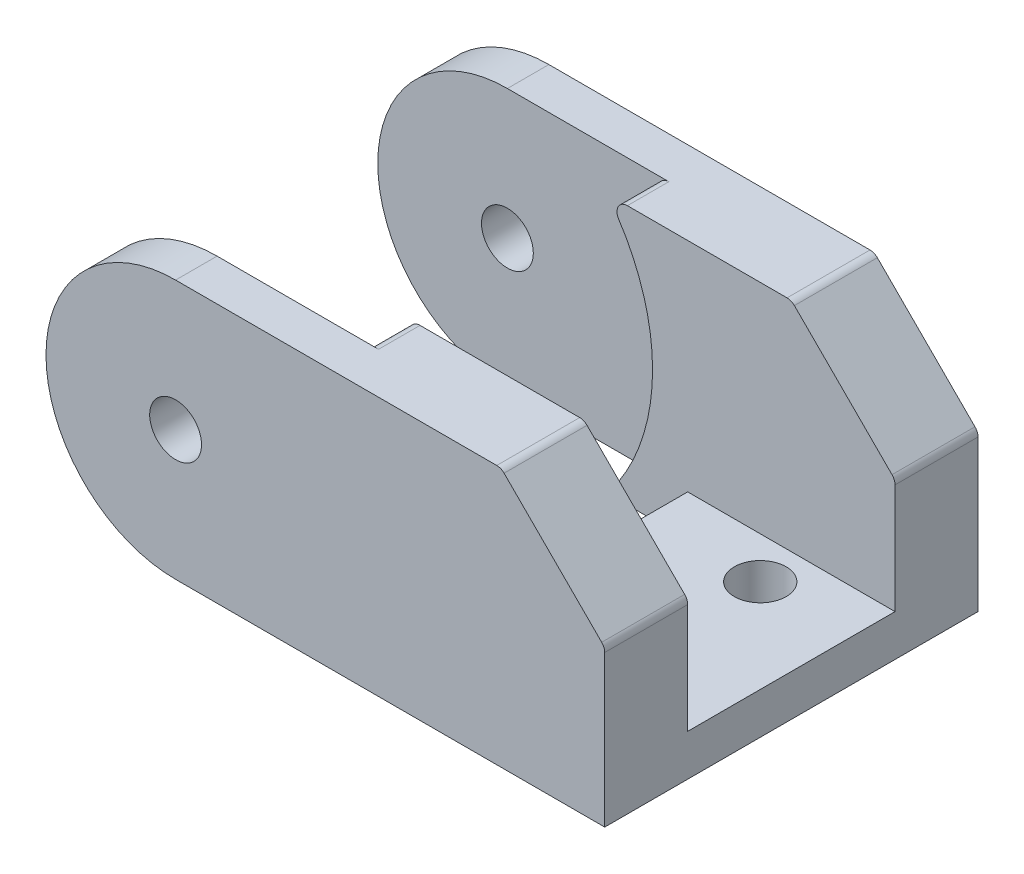
ISO-10303-21;
HEADER;
FILE_DESCRIPTION(('STEP AP214'),'2;1');
FILE_NAME('part.step','',(''),(''),'','','');
FILE_SCHEMA(('AUTOMOTIVE_DESIGN { 1 0 10303 214 1 1 1 1 }'));
ENDSEC;
DATA;
#1=APPLICATION_CONTEXT('core data for automotive mechanical design processes');
#2=APPLICATION_PROTOCOL_DEFINITION('international standard','automotive_design',2000,#1);
#3=PRODUCT_CONTEXT('',#1,'mechanical');
#4=PRODUCT('Part','Part','',(#3));
#5=PRODUCT_RELATED_PRODUCT_CATEGORY('part','',(#4));
#6=PRODUCT_DEFINITION_FORMATION('','',#4);
#7=PRODUCT_DEFINITION_CONTEXT('part definition',#1,'design');
#8=PRODUCT_DEFINITION('design','',#6,#7);
#9=PRODUCT_DEFINITION_SHAPE('','',#8);
#10=(LENGTH_UNIT() NAMED_UNIT(*) SI_UNIT(.MILLI.,.METRE.));
#11=(NAMED_UNIT(*) PLANE_ANGLE_UNIT() SI_UNIT($,.RADIAN.));
#12=(NAMED_UNIT(*) SI_UNIT($,.STERADIAN.) SOLID_ANGLE_UNIT());
#13=UNCERTAINTY_MEASURE_WITH_UNIT(LENGTH_MEASURE(1.E-05),#10,'distance_accuracy_value','');
#14=(GEOMETRIC_REPRESENTATION_CONTEXT(3) GLOBAL_UNCERTAINTY_ASSIGNED_CONTEXT((#13)) GLOBAL_UNIT_ASSIGNED_CONTEXT((#10,
#11,#12)) REPRESENTATION_CONTEXT('',''));
#15=CARTESIAN_POINT('',(0.,0.,0.));
#16=DIRECTION('',(0.,0.,1.));
#17=DIRECTION('',(1.,0.,0.));
#18=AXIS2_PLACEMENT_3D('',#15,#16,#17);
#19=CARTESIAN_POINT('',(0.,0.,2.));
#20=DIRECTION('',(0.,0.,1.));
#21=DIRECTION('',(1.,0.,0.));
#22=AXIS2_PLACEMENT_3D('',#19,#20,#21);
#23=PLANE('',#22);
#24=CARTESIAN_POINT('',(0.,0.,2.));
#25=DIRECTION('',(0.,0.,1.));
#26=DIRECTION('',(1.,0.,0.));
#27=AXIS2_PLACEMENT_3D('',#24,#25,#26);
#28=CIRCLE('',#27,1.25);
#29=CARTESIAN_POINT('',(1.25,0.,2.));
#30=VERTEX_POINT('',#29);
#31=EDGE_CURVE('E325',#30,#30,#28,.T.);
#32=ORIENTED_EDGE('',*,*,#31,.F.);
#33=EDGE_LOOP('',(#32));
#34=FACE_BOUND('',#33,.T.);
#35=CARTESIAN_POINT('',(-1.,0.,2.));
#36=DIRECTION('',(0.,0.,1.));
#37=DIRECTION('',(1.,0.,0.));
#38=AXIS2_PLACEMENT_3D('',#35,#36,#37);
#39=CIRCLE('',#38,10.);
#40=CARTESIAN_POINT('',(7.36727780514551,5.47619047619047,2.));
#41=VERTEX_POINT('',#40);
#42=CARTESIAN_POINT('',(7.36727780514551,-5.47619047619047,2.));
#43=VERTEX_POINT('',#42);
#44=EDGE_CURVE('E382',#41,#43,#39,.F.);
#45=ORIENTED_EDGE('',*,*,#44,.F.);
#46=CARTESIAN_POINT('',(7.78564169540279,5.75,2.));
#47=DIRECTION('',(0.,0.,1.));
#48=DIRECTION('',(1.,0.,0.));
#49=AXIS2_PLACEMENT_3D('',#46,#47,#48);
#50=CIRCLE('',#49,0.5);
#51=CARTESIAN_POINT('',(7.78564169540279,6.25,2.));
#52=VERTEX_POINT('',#51);
#53=EDGE_CURVE('E318',#41,#52,#50,.F.);
#54=ORIENTED_EDGE('',*,*,#53,.T.);
#55=DIRECTION('',(1.,0.,0.));
#56=VECTOR('',#55,1.);
#57=CARTESIAN_POINT('',(0.,6.25,2.));
#58=LINE('',#57,#56);
#59=CARTESIAN_POINT('',(0.,6.25,2.));
#60=VERTEX_POINT('',#59);
#61=EDGE_CURVE('E260',#60,#52,#58,.T.);
#62=ORIENTED_EDGE('',*,*,#61,.F.);
#63=CARTESIAN_POINT('',(0.,0.,2.));
#64=DIRECTION('',(0.,0.,1.));
#65=DIRECTION('',(1.,0.,0.));
#66=AXIS2_PLACEMENT_3D('',#63,#64,#65);
#67=CIRCLE('',#66,6.25);
#68=CARTESIAN_POINT('',(0.,-6.25,2.));
#69=VERTEX_POINT('',#68);
#70=EDGE_CURVE('E262',#60,#69,#67,.T.);
#71=ORIENTED_EDGE('',*,*,#70,.T.);
#72=DIRECTION('',(-1.,0.,0.));
#73=VECTOR('',#72,1.);
#74=CARTESIAN_POINT('',(0.,-6.25,2.));
#75=LINE('',#74,#73);
#76=CARTESIAN_POINT('',(7.78564169540279,-6.25,2.));
#77=VERTEX_POINT('',#76);
#78=EDGE_CURVE('E266',#77,#69,#75,.T.);
#79=ORIENTED_EDGE('',*,*,#78,.F.);
#80=CARTESIAN_POINT('',(7.78564169540279,-5.75,2.));
#81=DIRECTION('',(0.,0.,1.));
#82=DIRECTION('',(1.,0.,0.));
#83=AXIS2_PLACEMENT_3D('',#80,#81,#82);
#84=CIRCLE('',#83,0.5);
#85=EDGE_CURVE('E316',#77,#43,#84,.F.);
#86=ORIENTED_EDGE('',*,*,#85,.T.);
#87=EDGE_LOOP('',(#45,#54,#62,#71,#79,#86));
#88=FACE_BOUND('',#87,.T.);
#89=ADVANCED_FACE('F48',(#34,#88),#23,.T.);
#90=CARTESIAN_POINT('',(0.,-4.25,0.));
#91=DIRECTION('',(0.,1.,0.));
#92=DIRECTION('',(-1.,0.,0.));
#93=AXIS2_PLACEMENT_3D('',#90,#91,#92);
#94=PLANE('',#93);
#95=CARTESIAN_POINT('',(16.193752502002,-4.25,12.));
#96=DIRECTION('',(0.,1.,0.));
#97=DIRECTION('',(1.,0.,0.));
#98=AXIS2_PLACEMENT_3D('',#95,#96,#97);
#99=CIRCLE('',#98,1.25);
#100=CARTESIAN_POINT('',(17.443752502002,-4.25,12.));
#101=VERTEX_POINT('',#100);
#102=EDGE_CURVE('E480',#101,#101,#99,.T.);
#103=ORIENTED_EDGE('',*,*,#102,.F.);
#104=EDGE_LOOP('',(#103));
#105=FACE_BOUND('',#104,.T.);
#106=CARTESIAN_POINT('',(16.193752502002,-4.25,6.));
#107=DIRECTION('',(0.,1.,0.));
#108=DIRECTION('',(-1.,0.,0.));
#109=AXIS2_PLACEMENT_3D('',#106,#107,#108);
#110=CIRCLE('',#109,1.25);
#111=CARTESIAN_POINT('',(14.943752502002,-4.25,6.));
#112=VERTEX_POINT('',#111);
#113=EDGE_CURVE('E474',#112,#112,#110,.T.);
#114=ORIENTED_EDGE('',*,*,#113,.F.);
#115=EDGE_LOOP('',(#114));
#116=FACE_BOUND('',#115,.T.);
#117=DIRECTION('',(-1.,0.,0.));
#118=VECTOR('',#117,1.);
#119=CARTESIAN_POINT('',(0.,-4.25,14.));
#120=LINE('',#119,#118);
#121=CARTESIAN_POINT('',(20.693752502002,-4.25,14.));
#122=VERTEX_POINT('',#121);
#123=CARTESIAN_POINT('',(10.693752502002,-4.25,14.));
#124=VERTEX_POINT('',#123);
#125=EDGE_CURVE('E237',#122,#124,#120,.T.);
#126=ORIENTED_EDGE('',*,*,#125,.F.);
#127=DIRECTION('',(0.,0.,1.));
#128=VECTOR('',#127,1.);
#129=CARTESIAN_POINT('',(20.693752502002,-4.25,18.));
#130=LINE('',#129,#128);
#131=CARTESIAN_POINT('',(20.693752502002,-4.25,4.));
#132=VERTEX_POINT('',#131);
#133=EDGE_CURVE('E231',#132,#122,#130,.T.);
#134=ORIENTED_EDGE('',*,*,#133,.F.);
#135=DIRECTION('',(1.,0.,0.));
#136=VECTOR('',#135,1.);
#137=CARTESIAN_POINT('',(0.,-4.25,4.));
#138=LINE('',#137,#136);
#139=CARTESIAN_POINT('',(10.693752502002,-4.25,4.));
#140=VERTEX_POINT('',#139);
#141=EDGE_CURVE('E213',#140,#132,#138,.T.);
#142=ORIENTED_EDGE('',*,*,#141,.F.);
#143=DIRECTION('',(0.,0.,-1.));
#144=VECTOR('',#143,1.);
#145=CARTESIAN_POINT('',(10.693752502002,-4.25,18.));
#146=LINE('',#145,#144);
#147=EDGE_CURVE('E241',#124,#140,#146,.T.);
#148=ORIENTED_EDGE('',*,*,#147,.F.);
#149=EDGE_LOOP('',(#126,#134,#142,#148));
#150=FACE_BOUND('',#149,.T.);
#151=ADVANCED_FACE('F239',(#105,#116,#150),#94,.T.);
#152=CARTESIAN_POINT('',(0.,6.25,2.));
#153=DIRECTION('',(0.,1.,0.));
#154=DIRECTION('',(-1.,0.,0.));
#155=AXIS2_PLACEMENT_3D('',#152,#153,#154);
#156=PLANE('',#155);
#157=DIRECTION('',(1.,0.,0.));
#158=VECTOR('',#157,1.);
#159=CARTESIAN_POINT('',(0.,6.25,4.));
#160=LINE('',#159,#158);
#161=CARTESIAN_POINT('',(7.78564169540279,6.25,4.));
#162=VERTEX_POINT('',#161);
#163=CARTESIAN_POINT('',(15.4866457208155,6.25,4.));
#164=VERTEX_POINT('',#163);
#165=EDGE_CURVE('E367',#162,#164,#160,.T.);
#166=ORIENTED_EDGE('',*,*,#165,.T.);
#167=DIRECTION('',(0.,0.,1.));
#168=VECTOR('',#167,1.);
#169=CARTESIAN_POINT('',(15.4866457208155,6.25,2.));
#170=LINE('',#169,#168);
#171=CARTESIAN_POINT('',(15.4866457208155,6.25,0.));
#172=VERTEX_POINT('',#171);
#173=EDGE_CURVE('E56',#164,#172,#170,.F.);
#174=ORIENTED_EDGE('',*,*,#173,.T.);
#175=DIRECTION('',(1.,0.,0.));
#176=VECTOR('',#175,1.);
#177=CARTESIAN_POINT('',(0.,6.25,0.));
#178=LINE('',#177,#176);
#179=CARTESIAN_POINT('',(0.,6.25,0.));
#180=VERTEX_POINT('',#179);
#181=EDGE_CURVE('E259',#180,#172,#178,.T.);
#182=ORIENTED_EDGE('',*,*,#181,.F.);
#183=DIRECTION('',(0.,0.,-1.));
#184=VECTOR('',#183,1.);
#185=CARTESIAN_POINT('',(0.,6.25,2.));
#186=LINE('',#185,#184);
#187=EDGE_CURVE('E224',#60,#180,#186,.T.);
#188=ORIENTED_EDGE('',*,*,#187,.F.);
#189=ORIENTED_EDGE('',*,*,#61,.T.);
#190=DIRECTION('',(0.,0.,-1.));
#191=VECTOR('',#190,1.);
#192=CARTESIAN_POINT('',(7.78564169540279,6.25,2.));
#193=LINE('',#192,#191);
#194=EDGE_CURVE('E309',#52,#162,#193,.F.);
#195=ORIENTED_EDGE('',*,*,#194,.T.);
#196=EDGE_LOOP('',(#166,#174,#182,#188,#189,#195));
#197=FACE_BOUND('',#196,.T.);
#198=ADVANCED_FACE('F365',(#197),#156,.T.);
#199=CARTESIAN_POINT('',(0.,0.,2.));
#200=DIRECTION('',(0.,0.,-1.));
#201=DIRECTION('',(-1.,0.,0.));
#202=AXIS2_PLACEMENT_3D('',#199,#200,#201);
#203=CYLINDRICAL_SURFACE('',#202,6.25);
#204=CARTESIAN_POINT('',(0.,0.,0.));
#205=DIRECTION('',(0.,0.,1.));
#206=DIRECTION('',(1.,0.,0.));
#207=AXIS2_PLACEMENT_3D('',#204,#205,#206);
#208=CIRCLE('',#207,6.25);
#209=CARTESIAN_POINT('',(0.,-6.25,0.));
#210=VERTEX_POINT('',#209);
#211=EDGE_CURVE('E271',#180,#210,#208,.T.);
#212=ORIENTED_EDGE('',*,*,#211,.T.);
#213=DIRECTION('',(0.,0.,-1.));
#214=VECTOR('',#213,1.);
#215=CARTESIAN_POINT('',(0.,-6.25,2.));
#216=LINE('',#215,#214);
#217=EDGE_CURVE('E268',#69,#210,#216,.T.);
#218=ORIENTED_EDGE('',*,*,#217,.F.);
#219=ORIENTED_EDGE('',*,*,#70,.F.);
#220=ORIENTED_EDGE('',*,*,#187,.T.);
#221=EDGE_LOOP('',(#212,#218,#219,#220));
#222=FACE_BOUND('',#221,.T.);
#223=ADVANCED_FACE('F375',(#222),#203,.T.);
#224=CARTESIAN_POINT('',(0.,-6.25,2.));
#225=DIRECTION('',(0.,-1.,0.));
#226=DIRECTION('',(1.,0.,0.));
#227=AXIS2_PLACEMENT_3D('',#224,#225,#226);
#228=PLANE('',#227);
#229=CARTESIAN_POINT('',(16.193752502002,-6.25,12.));
#230=DIRECTION('',(0.,1.,0.));
#231=DIRECTION('',(1.,0.,0.));
#232=AXIS2_PLACEMENT_3D('',#229,#230,#231);
#233=CIRCLE('',#232,1.25);
#234=CARTESIAN_POINT('',(17.443752502002,-6.25,12.));
#235=VERTEX_POINT('',#234);
#236=EDGE_CURVE('E477',#235,#235,#233,.T.);
#237=ORIENTED_EDGE('',*,*,#236,.T.);
#238=EDGE_LOOP('',(#237));
#239=FACE_BOUND('',#238,.T.);
#240=CARTESIAN_POINT('',(16.193752502002,-6.25,6.));
#241=DIRECTION('',(0.,1.,0.));
#242=DIRECTION('',(-1.,0.,0.));
#243=AXIS2_PLACEMENT_3D('',#240,#241,#242);
#244=CIRCLE('',#243,1.25);
#245=CARTESIAN_POINT('',(14.943752502002,-6.25,6.));
#246=VERTEX_POINT('',#245);
#247=EDGE_CURVE('E471',#246,#246,#244,.T.);
#248=ORIENTED_EDGE('',*,*,#247,.T.);
#249=EDGE_LOOP('',(#248));
#250=FACE_BOUND('',#249,.T.);
#251=DIRECTION('',(-1.,0.,0.));
#252=VECTOR('',#251,1.);
#253=CARTESIAN_POINT('',(0.,-6.25,16.));
#254=LINE('',#253,#252);
#255=CARTESIAN_POINT('',(7.78564169540279,-6.25,16.));
#256=VERTEX_POINT('',#255);
#257=CARTESIAN_POINT('',(0.,-6.25,16.));
#258=VERTEX_POINT('',#257);
#259=EDGE_CURVE('E407',#256,#258,#254,.T.);
#260=ORIENTED_EDGE('',*,*,#259,.F.);
#261=DIRECTION('',(0.,0.,-1.));
#262=VECTOR('',#261,1.);
#263=CARTESIAN_POINT('',(7.78564169540279,-6.25,14.));
#264=LINE('',#263,#262);
#265=CARTESIAN_POINT('',(7.78564169540279,-6.25,14.));
#266=VERTEX_POINT('',#265);
#267=EDGE_CURVE('E291',#256,#266,#264,.T.);
#268=ORIENTED_EDGE('',*,*,#267,.T.);
#269=DIRECTION('',(-1.,0.,0.));
#270=VECTOR('',#269,1.);
#271=CARTESIAN_POINT('',(0.,-6.25,14.));
#272=LINE('',#271,#270);
#273=CARTESIAN_POINT('',(10.693752502002,-6.25,14.));
#274=VERTEX_POINT('',#273);
#275=EDGE_CURVE('E443',#274,#266,#272,.T.);
#276=ORIENTED_EDGE('',*,*,#275,.F.);
#277=DIRECTION('',(0.,0.,-1.));
#278=VECTOR('',#277,1.);
#279=CARTESIAN_POINT('',(10.693752502002,-6.25,18.));
#280=LINE('',#279,#278);
#281=CARTESIAN_POINT('',(10.693752502002,-6.25,4.));
#282=VERTEX_POINT('',#281);
#283=EDGE_CURVE('E242',#274,#282,#280,.T.);
#284=ORIENTED_EDGE('',*,*,#283,.T.);
#285=DIRECTION('',(-1.,0.,0.));
#286=VECTOR('',#285,1.);
#287=CARTESIAN_POINT('',(0.,-6.25,4.));
#288=LINE('',#287,#286);
#289=CARTESIAN_POINT('',(7.78564169540279,-6.25,4.));
#290=VERTEX_POINT('',#289);
#291=EDGE_CURVE('E236',#282,#290,#288,.T.);
#292=ORIENTED_EDGE('',*,*,#291,.T.);
#293=DIRECTION('',(0.,0.,-1.));
#294=VECTOR('',#293,1.);
#295=CARTESIAN_POINT('',(7.78564169540279,-6.25,2.));
#296=LINE('',#295,#294);
#297=EDGE_CURVE('E288',#290,#77,#296,.T.);
#298=ORIENTED_EDGE('',*,*,#297,.T.);
#299=ORIENTED_EDGE('',*,*,#78,.T.);
#300=ORIENTED_EDGE('',*,*,#217,.T.);
#301=DIRECTION('',(-1.,0.,0.));
#302=VECTOR('',#301,1.);
#303=CARTESIAN_POINT('',(0.,-6.25,0.));
#304=LINE('',#303,#302);
#305=CARTESIAN_POINT('',(20.693752502002,-6.25,0.));
#306=VERTEX_POINT('',#305);
#307=EDGE_CURVE('E263',#306,#210,#304,.T.);
#308=ORIENTED_EDGE('',*,*,#307,.F.);
#309=DIRECTION('',(0.,0.,-1.));
#310=VECTOR('',#309,1.);
#311=CARTESIAN_POINT('',(20.693752502002,-6.25,2.));
#312=LINE('',#311,#310);
#313=CARTESIAN_POINT('',(20.693752502002,-6.25,18.));
#314=VERTEX_POINT('',#313);
#315=EDGE_CURVE('E256',#314,#306,#312,.T.);
#316=ORIENTED_EDGE('',*,*,#315,.F.);
#317=DIRECTION('',(-1.,0.,0.));
#318=VECTOR('',#317,1.);
#319=CARTESIAN_POINT('',(20.693752502002,-6.25,18.));
#320=LINE('',#319,#318);
#321=CARTESIAN_POINT('',(0.,-6.25,18.));
#322=VERTEX_POINT('',#321);
#323=EDGE_CURVE('E246',#314,#322,#320,.T.);
#324=ORIENTED_EDGE('',*,*,#323,.T.);
#325=DIRECTION('',(0.,0.,1.));
#326=VECTOR('',#325,1.);
#327=CARTESIAN_POINT('',(0.,-6.25,16.));
#328=LINE('',#327,#326);
#329=EDGE_CURVE('E409',#258,#322,#328,.T.);
#330=ORIENTED_EDGE('',*,*,#329,.F.);
#331=EDGE_LOOP('',(#260,#268,#276,#284,#292,#298,#299,#300,#308,#316,#324,#330));
#332=FACE_BOUND('',#331,.T.);
#333=ADVANCED_FACE('F449',(#239,#250,#332),#228,.T.);
#334=CARTESIAN_POINT('',(0.,0.,0.));
#335=DIRECTION('',(0.,0.,1.));
#336=DIRECTION('',(1.,0.,0.));
#337=AXIS2_PLACEMENT_3D('',#334,#335,#336);
#338=PLANE('',#337);
#339=CARTESIAN_POINT('',(0.,0.,0.));
#340=DIRECTION('',(0.,0.,1.));
#341=DIRECTION('',(1.,0.,0.));
#342=AXIS2_PLACEMENT_3D('',#339,#340,#341);
#343=CIRCLE('',#342,1.25);
#344=CARTESIAN_POINT('',(1.25,0.,0.));
#345=VERTEX_POINT('',#344);
#346=EDGE_CURVE('E326',#345,#345,#343,.T.);
#347=ORIENTED_EDGE('',*,*,#346,.T.);
#348=EDGE_LOOP('',(#347));
#349=FACE_BOUND('',#348,.T.);
#350=DIRECTION('',(-0.707106781186547,0.707106781186548,0.));
#351=VECTOR('',#350,1.);
#352=CARTESIAN_POINT('',(15.693752502002,6.25,0.));
#353=LINE('',#352,#351);
#354=CARTESIAN_POINT('',(15.8401991114087,6.10355339059327,0.));
#355=VERTEX_POINT('',#354);
#356=CARTESIAN_POINT('',(20.5473058925953,1.39644660940671,0.));
#357=VERTEX_POINT('',#356);
#358=EDGE_CURVE('E332',#355,#357,#353,.F.);
#359=ORIENTED_EDGE('',*,*,#358,.T.);
#360=CARTESIAN_POINT('',(20.193752502002,1.04289321881344,0.));
#361=DIRECTION('',(0.,0.,1.));
#362=DIRECTION('',(1.,0.,0.));
#363=AXIS2_PLACEMENT_3D('',#360,#361,#362);
#364=CIRCLE('',#363,0.5);
#365=CARTESIAN_POINT('',(20.693752502002,1.04289321881344,0.));
#366=VERTEX_POINT('',#365);
#367=EDGE_CURVE('E361',#357,#366,#364,.F.);
#368=ORIENTED_EDGE('',*,*,#367,.T.);
#369=DIRECTION('',(0.,-1.,0.));
#370=VECTOR('',#369,1.);
#371=CARTESIAN_POINT('',(20.693752502002,-6.25,0.));
#372=LINE('',#371,#370);
#373=EDGE_CURVE('E254',#366,#306,#372,.T.);
#374=ORIENTED_EDGE('',*,*,#373,.T.);
#375=ORIENTED_EDGE('',*,*,#307,.T.);
#376=ORIENTED_EDGE('',*,*,#211,.F.);
#377=ORIENTED_EDGE('',*,*,#181,.T.);
#378=CARTESIAN_POINT('',(15.4866457208155,5.75,0.));
#379=DIRECTION('',(0.,0.,1.));
#380=DIRECTION('',(1.,0.,0.));
#381=AXIS2_PLACEMENT_3D('',#378,#379,#380);
#382=CIRCLE('',#381,0.5);
#383=EDGE_CURVE('E63',#172,#355,#382,.F.);
#384=ORIENTED_EDGE('',*,*,#383,.T.);
#385=EDGE_LOOP('',(#359,#368,#374,#375,#376,#377,#384));
#386=FACE_BOUND('',#385,.T.);
#387=ADVANCED_FACE('F371',(#349,#386),#338,.F.);
#388=CARTESIAN_POINT('',(20.693752502002,-6.25,2.));
#389=DIRECTION('',(1.,0.,0.));
#390=DIRECTION('',(0.,0.,-1.));
#391=AXIS2_PLACEMENT_3D('',#388,#389,#390);
#392=PLANE('',#391);
#393=DIRECTION('',(0.,1.,0.));
#394=VECTOR('',#393,1.);
#395=CARTESIAN_POINT('',(20.693752502002,-4.25,14.));
#396=LINE('',#395,#394);
#397=CARTESIAN_POINT('',(20.693752502002,1.04289321881346,14.));
#398=VERTEX_POINT('',#397);
#399=EDGE_CURVE('E456',#122,#398,#396,.T.);
#400=ORIENTED_EDGE('',*,*,#399,.T.);
#401=DIRECTION('',(0.,0.,-1.));
#402=VECTOR('',#401,1.);
#403=CARTESIAN_POINT('',(20.693752502002,1.04289321881346,2.));
#404=LINE('',#403,#402);
#405=CARTESIAN_POINT('',(20.693752502002,1.04289321881346,18.));
#406=VERTEX_POINT('',#405);
#407=EDGE_CURVE('E338',#398,#406,#404,.F.);
#408=ORIENTED_EDGE('',*,*,#407,.T.);
#409=DIRECTION('',(0.,-1.,0.));
#410=VECTOR('',#409,1.);
#411=CARTESIAN_POINT('',(20.693752502002,-4.25,18.));
#412=LINE('',#411,#410);
#413=EDGE_CURVE('E244',#406,#314,#412,.T.);
#414=ORIENTED_EDGE('',*,*,#413,.T.);
#415=ORIENTED_EDGE('',*,*,#315,.T.);
#416=ORIENTED_EDGE('',*,*,#373,.F.);
#417=DIRECTION('',(0.,0.,-1.));
#418=VECTOR('',#417,1.);
#419=CARTESIAN_POINT('',(20.693752502002,1.04289321881344,2.));
#420=LINE('',#419,#418);
#421=CARTESIAN_POINT('',(20.693752502002,1.04289321881344,4.));
#422=VERTEX_POINT('',#421);
#423=EDGE_CURVE('E235',#366,#422,#420,.F.);
#424=ORIENTED_EDGE('',*,*,#423,.T.);
#425=DIRECTION('',(0.,1.,0.));
#426=VECTOR('',#425,1.);
#427=CARTESIAN_POINT('',(20.693752502002,-4.25,4.));
#428=LINE('',#427,#426);
#429=EDGE_CURVE('E216',#132,#422,#428,.T.);
#430=ORIENTED_EDGE('',*,*,#429,.F.);
#431=ORIENTED_EDGE('',*,*,#133,.T.);
#432=EDGE_LOOP('',(#400,#408,#414,#415,#416,#424,#430,#431));
#433=FACE_BOUND('',#432,.T.);
#434=ADVANCED_FACE('F230',(#433),#392,.T.);
#435=CARTESIAN_POINT('',(10.693752502002,-4.25,18.));
#436=DIRECTION('',(-1.,0.,0.));
#437=DIRECTION('',(0.,-1.,0.));
#438=AXIS2_PLACEMENT_3D('',#435,#436,#437);
#439=PLANE('',#438);
#440=DIRECTION('',(0.,-1.,0.));
#441=VECTOR('',#440,1.);
#442=CARTESIAN_POINT('',(10.693752502002,-4.25,14.));
#443=LINE('',#442,#441);
#444=EDGE_CURVE('E280',#124,#274,#443,.T.);
#445=ORIENTED_EDGE('',*,*,#444,.F.);
#446=ORIENTED_EDGE('',*,*,#147,.T.);
#447=DIRECTION('',(0.,1.,0.));
#448=VECTOR('',#447,1.);
#449=CARTESIAN_POINT('',(10.693752502002,-4.25,4.));
#450=LINE('',#449,#448);
#451=EDGE_CURVE('E219',#282,#140,#450,.T.);
#452=ORIENTED_EDGE('',*,*,#451,.F.);
#453=ORIENTED_EDGE('',*,*,#283,.F.);
#454=EDGE_LOOP('',(#445,#446,#452,#453));
#455=FACE_BOUND('',#454,.T.);
#456=ADVANCED_FACE('F719',(#455),#439,.T.);
#457=CARTESIAN_POINT('',(20.693752502002,-4.25,18.));
#458=DIRECTION('',(0.,0.,1.));
#459=DIRECTION('',(1.,0.,0.));
#460=AXIS2_PLACEMENT_3D('',#457,#458,#459);
#461=PLANE('',#460);
#462=CARTESIAN_POINT('',(0.,0.,18.));
#463=DIRECTION('',(0.,0.,1.));
#464=DIRECTION('',(1.,0.,0.));
#465=AXIS2_PLACEMENT_3D('',#462,#463,#464);
#466=CIRCLE('',#465,1.25);
#467=CARTESIAN_POINT('',(1.25,0.,18.));
#468=VERTEX_POINT('',#467);
#469=EDGE_CURVE('E468',#468,#468,#466,.T.);
#470=ORIENTED_EDGE('',*,*,#469,.F.);
#471=EDGE_LOOP('',(#470));
#472=FACE_BOUND('',#471,.T.);
#473=ORIENTED_EDGE('',*,*,#413,.F.);
#474=CARTESIAN_POINT('',(20.193752502002,1.04289321881346,18.));
#475=DIRECTION('',(0.,0.,1.));
#476=DIRECTION('',(1.,0.,0.));
#477=AXIS2_PLACEMENT_3D('',#474,#475,#476);
#478=CIRCLE('',#477,0.5);
#479=CARTESIAN_POINT('',(20.5473058925953,1.39644660940673,18.));
#480=VERTEX_POINT('',#479);
#481=EDGE_CURVE('E343',#406,#480,#478,.T.);
#482=ORIENTED_EDGE('',*,*,#481,.T.);
#483=DIRECTION('',(0.707106781186549,-0.707106781186546,0.));
#484=VECTOR('',#483,1.);
#485=CARTESIAN_POINT('',(23.443752502002,-1.49999999999999,18.));
#486=LINE('',#485,#484);
#487=CARTESIAN_POINT('',(15.8401991114087,6.10355339059327,18.));
#488=VERTEX_POINT('',#487);
#489=EDGE_CURVE('E321',#480,#488,#486,.F.);
#490=ORIENTED_EDGE('',*,*,#489,.T.);
#491=CARTESIAN_POINT('',(15.4866457208154,5.75,18.));
#492=DIRECTION('',(0.,0.,1.));
#493=DIRECTION('',(1.,0.,0.));
#494=AXIS2_PLACEMENT_3D('',#491,#492,#493);
#495=CIRCLE('',#494,0.5);
#496=CARTESIAN_POINT('',(15.4866457208154,6.25,18.));
#497=VERTEX_POINT('',#496);
#498=EDGE_CURVE('E341',#488,#497,#495,.T.);
#499=ORIENTED_EDGE('',*,*,#498,.T.);
#500=DIRECTION('',(1.,0.,0.));
#501=VECTOR('',#500,1.);
#502=CARTESIAN_POINT('',(0.,6.25,18.));
#503=LINE('',#502,#501);
#504=CARTESIAN_POINT('',(0.,6.25,18.));
#505=VERTEX_POINT('',#504);
#506=EDGE_CURVE('E400',#505,#497,#503,.T.);
#507=ORIENTED_EDGE('',*,*,#506,.F.);
#508=CARTESIAN_POINT('',(0.,0.,18.));
#509=DIRECTION('',(0.,0.,1.));
#510=DIRECTION('',(1.,0.,0.));
#511=AXIS2_PLACEMENT_3D('',#508,#509,#510);
#512=CIRCLE('',#511,6.25);
#513=EDGE_CURVE('E404',#505,#322,#512,.T.);
#514=ORIENTED_EDGE('',*,*,#513,.T.);
#515=ORIENTED_EDGE('',*,*,#323,.F.);
#516=EDGE_LOOP('',(#473,#482,#490,#499,#507,#514,#515));
#517=FACE_BOUND('',#516,.T.);
#518=ADVANCED_FACE('F425',(#472,#517),#461,.T.);
#519=CARTESIAN_POINT('',(0.,6.25,16.));
#520=DIRECTION('',(0.,1.,0.));
#521=DIRECTION('',(-1.,0.,0.));
#522=AXIS2_PLACEMENT_3D('',#519,#520,#521);
#523=PLANE('',#522);
#524=ORIENTED_EDGE('',*,*,#506,.T.);
#525=DIRECTION('',(0.,0.,1.));
#526=VECTOR('',#525,1.);
#527=CARTESIAN_POINT('',(15.4866457208154,6.25,16.));
#528=LINE('',#527,#526);
#529=CARTESIAN_POINT('',(15.4866457208154,6.25,14.));
#530=VERTEX_POINT('',#529);
#531=EDGE_CURVE('E13',#497,#530,#528,.F.);
#532=ORIENTED_EDGE('',*,*,#531,.T.);
#533=DIRECTION('',(1.,0.,0.));
#534=VECTOR('',#533,1.);
#535=CARTESIAN_POINT('',(0.,6.25,14.));
#536=LINE('',#535,#534);
#537=CARTESIAN_POINT('',(7.78564169540279,6.25,14.));
#538=VERTEX_POINT('',#537);
#539=EDGE_CURVE('E433',#538,#530,#536,.T.);
#540=ORIENTED_EDGE('',*,*,#539,.F.);
#541=DIRECTION('',(0.,0.,-1.));
#542=VECTOR('',#541,1.);
#543=CARTESIAN_POINT('',(7.78564169540279,6.25,16.));
#544=LINE('',#543,#542);
#545=CARTESIAN_POINT('',(7.78564169540279,6.25,16.));
#546=VERTEX_POINT('',#545);
#547=EDGE_CURVE('E297',#538,#546,#544,.F.);
#548=ORIENTED_EDGE('',*,*,#547,.T.);
#549=DIRECTION('',(1.,0.,0.));
#550=VECTOR('',#549,1.);
#551=CARTESIAN_POINT('',(0.,6.25,16.));
#552=LINE('',#551,#550);
#553=CARTESIAN_POINT('',(0.,6.25,16.));
#554=VERTEX_POINT('',#553);
#555=EDGE_CURVE('E401',#554,#546,#552,.T.);
#556=ORIENTED_EDGE('',*,*,#555,.F.);
#557=DIRECTION('',(0.,0.,1.));
#558=VECTOR('',#557,1.);
#559=CARTESIAN_POINT('',(0.,6.25,16.));
#560=LINE('',#559,#558);
#561=EDGE_CURVE('E249',#554,#505,#560,.T.);
#562=ORIENTED_EDGE('',*,*,#561,.T.);
#563=EDGE_LOOP('',(#524,#532,#540,#548,#556,#562));
#564=FACE_BOUND('',#563,.T.);
#565=ADVANCED_FACE('F421',(#564),#523,.T.);
#566=CARTESIAN_POINT('',(0.,0.,16.));
#567=DIRECTION('',(0.,0.,1.));
#568=DIRECTION('',(-1.,0.,0.));
#569=AXIS2_PLACEMENT_3D('',#566,#567,#568);
#570=CYLINDRICAL_SURFACE('',#569,6.25);
#571=ORIENTED_EDGE('',*,*,#513,.F.);
#572=ORIENTED_EDGE('',*,*,#561,.F.);
#573=CARTESIAN_POINT('',(0.,0.,16.));
#574=DIRECTION('',(0.,0.,1.));
#575=DIRECTION('',(1.,0.,0.));
#576=AXIS2_PLACEMENT_3D('',#573,#574,#575);
#577=CIRCLE('',#576,6.25);
#578=EDGE_CURVE('E403',#554,#258,#577,.T.);
#579=ORIENTED_EDGE('',*,*,#578,.T.);
#580=ORIENTED_EDGE('',*,*,#329,.T.);
#581=EDGE_LOOP('',(#571,#572,#579,#580));
#582=FACE_BOUND('',#581,.T.);
#583=ADVANCED_FACE('F690',(#582),#570,.T.);
#584=CARTESIAN_POINT('',(0.,0.,16.));
#585=DIRECTION('',(0.,0.,-1.));
#586=DIRECTION('',(1.,0.,0.));
#587=AXIS2_PLACEMENT_3D('',#584,#585,#586);
#588=PLANE('',#587);
#589=CARTESIAN_POINT('',(0.,0.,16.));
#590=DIRECTION('',(0.,0.,-1.));
#591=DIRECTION('',(-1.,0.,0.));
#592=AXIS2_PLACEMENT_3D('',#589,#590,#591);
#593=CIRCLE('',#592,1.25);
#594=CARTESIAN_POINT('',(-1.25,0.,16.));
#595=VERTEX_POINT('',#594);
#596=EDGE_CURVE('E322',#595,#595,#593,.T.);
#597=ORIENTED_EDGE('',*,*,#596,.F.);
#598=EDGE_LOOP('',(#597));
#599=FACE_BOUND('',#598,.T.);
#600=ORIENTED_EDGE('',*,*,#555,.T.);
#601=CARTESIAN_POINT('',(7.78564169540279,5.75,16.));
#602=DIRECTION('',(0.,0.,-1.));
#603=DIRECTION('',(-1.,0.,0.));
#604=AXIS2_PLACEMENT_3D('',#601,#602,#603);
#605=CIRCLE('',#604,0.5);
#606=CARTESIAN_POINT('',(7.36727780514551,5.47619047619047,16.));
#607=VERTEX_POINT('',#606);
#608=EDGE_CURVE('E314',#546,#607,#605,.F.);
#609=ORIENTED_EDGE('',*,*,#608,.T.);
#610=CARTESIAN_POINT('',(-1.,0.,16.));
#611=DIRECTION('',(0.,0.,-1.));
#612=DIRECTION('',(-1.,0.,0.));
#613=AXIS2_PLACEMENT_3D('',#610,#611,#612);
#614=CIRCLE('',#613,10.);
#615=CARTESIAN_POINT('',(7.36727780514551,-5.47619047619047,16.));
#616=VERTEX_POINT('',#615);
#617=EDGE_CURVE('E223',#607,#616,#614,.T.);
#618=ORIENTED_EDGE('',*,*,#617,.T.);
#619=CARTESIAN_POINT('',(7.78564169540279,-5.75,16.));
#620=DIRECTION('',(0.,0.,-1.));
#621=DIRECTION('',(-1.,0.,0.));
#622=AXIS2_PLACEMENT_3D('',#619,#620,#621);
#623=CIRCLE('',#622,0.5);
#624=EDGE_CURVE('E311',#616,#256,#623,.F.);
#625=ORIENTED_EDGE('',*,*,#624,.T.);
#626=ORIENTED_EDGE('',*,*,#259,.T.);
#627=ORIENTED_EDGE('',*,*,#578,.F.);
#628=EDGE_LOOP('',(#600,#609,#618,#625,#626,#627));
#629=FACE_BOUND('',#628,.T.);
#630=ADVANCED_FACE('F681',(#599,#629),#588,.T.);
#631=CARTESIAN_POINT('',(-1.,0.,4.));
#632=DIRECTION('',(0.,0.,-1.));
#633=DIRECTION('',(-1.,0.,0.));
#634=AXIS2_PLACEMENT_3D('',#631,#632,#633);
#635=CYLINDRICAL_SURFACE('',#634,10.);
#636=ORIENTED_EDGE('',*,*,#44,.T.);
#637=DIRECTION('',(0.,0.,-1.));
#638=VECTOR('',#637,1.);
#639=CARTESIAN_POINT('',(7.36727780514551,-5.47619047619047,4.));
#640=LINE('',#639,#638);
#641=CARTESIAN_POINT('',(7.36727780514551,-5.47619047619047,4.));
#642=VERTEX_POINT('',#641);
#643=EDGE_CURVE('E303',#43,#642,#640,.F.);
#644=ORIENTED_EDGE('',*,*,#643,.T.);
#645=CARTESIAN_POINT('',(-1.,0.,4.));
#646=DIRECTION('',(0.,0.,1.));
#647=DIRECTION('',(1.,0.,0.));
#648=AXIS2_PLACEMENT_3D('',#645,#646,#647);
#649=CIRCLE('',#648,10.);
#650=CARTESIAN_POINT('',(7.36727780514551,5.47619047619047,4.));
#651=VERTEX_POINT('',#650);
#652=EDGE_CURVE('E389',#642,#651,#649,.T.);
#653=ORIENTED_EDGE('',*,*,#652,.T.);
#654=DIRECTION('',(0.,0.,-1.));
#655=VECTOR('',#654,1.);
#656=CARTESIAN_POINT('',(7.36727780514551,5.47619047619047,4.));
#657=LINE('',#656,#655);
#658=EDGE_CURVE('E300',#651,#41,#657,.T.);
#659=ORIENTED_EDGE('',*,*,#658,.T.);
#660=EDGE_LOOP('',(#636,#644,#653,#659));
#661=FACE_BOUND('',#660,.T.);
#662=ADVANCED_FACE('F392',(#661),#635,.F.);
#663=CARTESIAN_POINT('',(0.,0.,4.));
#664=DIRECTION('',(0.,0.,1.));
#665=DIRECTION('',(1.,0.,0.));
#666=AXIS2_PLACEMENT_3D('',#663,#664,#665);
#667=PLANE('',#666);
#668=ORIENTED_EDGE('',*,*,#429,.T.);
#669=CARTESIAN_POINT('',(20.193752502002,1.04289321881344,4.));
#670=DIRECTION('',(0.,0.,1.));
#671=DIRECTION('',(1.,0.,0.));
#672=AXIS2_PLACEMENT_3D('',#669,#670,#671);
#673=CIRCLE('',#672,0.5);
#674=CARTESIAN_POINT('',(20.5473058925953,1.39644660940671,4.));
#675=VERTEX_POINT('',#674);
#676=EDGE_CURVE('E355',#422,#675,#673,.T.);
#677=ORIENTED_EDGE('',*,*,#676,.T.);
#678=DIRECTION('',(0.707106781186547,-0.707106781186548,0.));
#679=VECTOR('',#678,1.);
#680=CARTESIAN_POINT('',(10.971876251001,10.971876251001,4.));
#681=LINE('',#680,#679);
#682=CARTESIAN_POINT('',(15.8401991114087,6.10355339059327,4.));
#683=VERTEX_POINT('',#682);
#684=EDGE_CURVE('E334',#675,#683,#681,.F.);
#685=ORIENTED_EDGE('',*,*,#684,.T.);
#686=CARTESIAN_POINT('',(15.4866457208155,5.75,4.));
#687=DIRECTION('',(0.,0.,1.));
#688=DIRECTION('',(1.,0.,0.));
#689=AXIS2_PLACEMENT_3D('',#686,#687,#688);
#690=CIRCLE('',#689,0.5);
#691=EDGE_CURVE('E353',#683,#164,#690,.T.);
#692=ORIENTED_EDGE('',*,*,#691,.T.);
#693=ORIENTED_EDGE('',*,*,#165,.F.);
#694=CARTESIAN_POINT('',(7.78564169540279,5.75,4.));
#695=DIRECTION('',(0.,0.,1.));
#696=DIRECTION('',(1.,0.,0.));
#697=AXIS2_PLACEMENT_3D('',#694,#695,#696);
#698=CIRCLE('',#697,0.5);
#699=EDGE_CURVE('E305',#162,#651,#698,.T.);
#700=ORIENTED_EDGE('',*,*,#699,.T.);
#701=ORIENTED_EDGE('',*,*,#652,.F.);
#702=CARTESIAN_POINT('',(7.78564169540279,-5.75,4.));
#703=DIRECTION('',(0.,0.,1.));
#704=DIRECTION('',(1.,0.,0.));
#705=AXIS2_PLACEMENT_3D('',#702,#703,#704);
#706=CIRCLE('',#705,0.5);
#707=EDGE_CURVE('E307',#642,#290,#706,.T.);
#708=ORIENTED_EDGE('',*,*,#707,.T.);
#709=ORIENTED_EDGE('',*,*,#291,.F.);
#710=ORIENTED_EDGE('',*,*,#451,.T.);
#711=ORIENTED_EDGE('',*,*,#141,.T.);
#712=EDGE_LOOP('',(#668,#677,#685,#692,#693,#700,#701,#708,#709,#710,#711));
#713=FACE_BOUND('',#712,.T.);
#714=ADVANCED_FACE('F215',(#713),#667,.T.);
#715=CARTESIAN_POINT('',(-1.,0.,14.));
#716=DIRECTION('',(0.,0.,1.));
#717=DIRECTION('',(1.,0.,0.));
#718=AXIS2_PLACEMENT_3D('',#715,#716,#717);
#719=CYLINDRICAL_SURFACE('',#718,10.);
#720=CARTESIAN_POINT('',(-1.,0.,14.));
#721=DIRECTION('',(0.,0.,1.));
#722=DIRECTION('',(1.,0.,0.));
#723=AXIS2_PLACEMENT_3D('',#720,#721,#722);
#724=CIRCLE('',#723,10.);
#725=CARTESIAN_POINT('',(7.36727780514551,-5.47619047619047,14.));
#726=VERTEX_POINT('',#725);
#727=CARTESIAN_POINT('',(7.36727780514551,5.47619047619047,14.));
#728=VERTEX_POINT('',#727);
#729=EDGE_CURVE('E440',#726,#728,#724,.T.);
#730=ORIENTED_EDGE('',*,*,#729,.F.);
#731=DIRECTION('',(0.,0.,1.));
#732=VECTOR('',#731,1.);
#733=CARTESIAN_POINT('',(7.36727780514551,-5.47619047619047,14.));
#734=LINE('',#733,#732);
#735=EDGE_CURVE('E285',#726,#616,#734,.T.);
#736=ORIENTED_EDGE('',*,*,#735,.T.);
#737=ORIENTED_EDGE('',*,*,#617,.F.);
#738=DIRECTION('',(0.,0.,1.));
#739=VECTOR('',#738,1.);
#740=CARTESIAN_POINT('',(7.36727780514551,5.47619047619047,14.));
#741=LINE('',#740,#739);
#742=EDGE_CURVE('E283',#607,#728,#741,.F.);
#743=ORIENTED_EDGE('',*,*,#742,.T.);
#744=EDGE_LOOP('',(#730,#736,#737,#743));
#745=FACE_BOUND('',#744,.T.);
#746=ADVANCED_FACE('F650',(#745),#719,.F.);
#747=CARTESIAN_POINT('',(0.,0.,14.));
#748=DIRECTION('',(0.,0.,-1.));
#749=DIRECTION('',(1.,0.,0.));
#750=AXIS2_PLACEMENT_3D('',#747,#748,#749);
#751=PLANE('',#750);
#752=DIRECTION('',(-0.707106781186549,0.707106781186546,0.));
#753=VECTOR('',#752,1.);
#754=CARTESIAN_POINT('',(10.971876251001,10.971876251001,14.));
#755=LINE('',#754,#753);
#756=CARTESIAN_POINT('',(15.8401991114087,6.10355339059327,14.));
#757=VERTEX_POINT('',#756);
#758=CARTESIAN_POINT('',(20.5473058925953,1.39644660940673,14.));
#759=VERTEX_POINT('',#758);
#760=EDGE_CURVE('E329',#757,#759,#755,.F.);
#761=ORIENTED_EDGE('',*,*,#760,.T.);
#762=CARTESIAN_POINT('',(20.193752502002,1.04289321881346,14.));
#763=DIRECTION('',(0.,0.,-1.));
#764=DIRECTION('',(-1.,0.,0.));
#765=AXIS2_PLACEMENT_3D('',#762,#763,#764);
#766=CIRCLE('',#765,0.5);
#767=EDGE_CURVE('E351',#759,#398,#766,.T.);
#768=ORIENTED_EDGE('',*,*,#767,.T.);
#769=ORIENTED_EDGE('',*,*,#399,.F.);
#770=ORIENTED_EDGE('',*,*,#125,.T.);
#771=ORIENTED_EDGE('',*,*,#444,.T.);
#772=ORIENTED_EDGE('',*,*,#275,.T.);
#773=CARTESIAN_POINT('',(7.78564169540279,-5.75,14.));
#774=DIRECTION('',(0.,0.,-1.));
#775=DIRECTION('',(-1.,0.,0.));
#776=AXIS2_PLACEMENT_3D('',#773,#774,#775);
#777=CIRCLE('',#776,0.5);
#778=EDGE_CURVE('E295',#266,#726,#777,.T.);
#779=ORIENTED_EDGE('',*,*,#778,.T.);
#780=ORIENTED_EDGE('',*,*,#729,.T.);
#781=CARTESIAN_POINT('',(7.78564169540279,5.75,14.));
#782=DIRECTION('',(0.,0.,-1.));
#783=DIRECTION('',(-1.,0.,0.));
#784=AXIS2_PLACEMENT_3D('',#781,#782,#783);
#785=CIRCLE('',#784,0.5);
#786=EDGE_CURVE('E293',#728,#538,#785,.T.);
#787=ORIENTED_EDGE('',*,*,#786,.T.);
#788=ORIENTED_EDGE('',*,*,#539,.T.);
#789=CARTESIAN_POINT('',(15.4866457208154,5.75,14.));
#790=DIRECTION('',(0.,0.,-1.));
#791=DIRECTION('',(-1.,0.,0.));
#792=AXIS2_PLACEMENT_3D('',#789,#790,#791);
#793=CIRCLE('',#792,0.5);
#794=EDGE_CURVE('E349',#530,#757,#793,.T.);
#795=ORIENTED_EDGE('',*,*,#794,.T.);
#796=EDGE_LOOP('',(#761,#768,#769,#770,#771,#772,#779,#780,#787,#788,#795));
#797=FACE_BOUND('',#796,.T.);
#798=ADVANCED_FACE('F436',(#797),#751,.T.);
#799=CARTESIAN_POINT('',(7.78564169540279,-5.75,14.));
#800=DIRECTION('',(0.,0.,1.));
#801=DIRECTION('',(1.,0.,0.));
#802=AXIS2_PLACEMENT_3D('',#799,#800,#801);
#803=CYLINDRICAL_SURFACE('',#802,0.5);
#804=ORIENTED_EDGE('',*,*,#778,.F.);
#805=ORIENTED_EDGE('',*,*,#267,.F.);
#806=ORIENTED_EDGE('',*,*,#624,.F.);
#807=ORIENTED_EDGE('',*,*,#735,.F.);
#808=EDGE_LOOP('',(#804,#805,#806,#807));
#809=FACE_BOUND('',#808,.T.);
#810=ADVANCED_FACE('F528',(#809),#803,.T.);
#811=CARTESIAN_POINT('',(7.78564169540279,5.75,14.));
#812=DIRECTION('',(0.,0.,1.));
#813=DIRECTION('',(1.,0.,0.));
#814=AXIS2_PLACEMENT_3D('',#811,#812,#813);
#815=CYLINDRICAL_SURFACE('',#814,0.5);
#816=ORIENTED_EDGE('',*,*,#786,.F.);
#817=ORIENTED_EDGE('',*,*,#742,.F.);
#818=ORIENTED_EDGE('',*,*,#608,.F.);
#819=ORIENTED_EDGE('',*,*,#547,.F.);
#820=EDGE_LOOP('',(#816,#817,#818,#819));
#821=FACE_BOUND('',#820,.T.);
#822=ADVANCED_FACE('F531',(#821),#815,.T.);
#823=CARTESIAN_POINT('',(7.78564169540279,-5.75,4.));
#824=DIRECTION('',(0.,0.,-1.));
#825=DIRECTION('',(-1.,0.,0.));
#826=AXIS2_PLACEMENT_3D('',#823,#824,#825);
#827=CYLINDRICAL_SURFACE('',#826,0.5);
#828=ORIENTED_EDGE('',*,*,#707,.F.);
#829=ORIENTED_EDGE('',*,*,#643,.F.);
#830=ORIENTED_EDGE('',*,*,#85,.F.);
#831=ORIENTED_EDGE('',*,*,#297,.F.);
#832=EDGE_LOOP('',(#828,#829,#830,#831));
#833=FACE_BOUND('',#832,.T.);
#834=ADVANCED_FACE('F453',(#833),#827,.T.);
#835=CARTESIAN_POINT('',(7.78564169540279,5.75,4.));
#836=DIRECTION('',(0.,0.,-1.));
#837=DIRECTION('',(-1.,0.,0.));
#838=AXIS2_PLACEMENT_3D('',#835,#836,#837);
#839=CYLINDRICAL_SURFACE('',#838,0.5);
#840=ORIENTED_EDGE('',*,*,#699,.F.);
#841=ORIENTED_EDGE('',*,*,#194,.F.);
#842=ORIENTED_EDGE('',*,*,#53,.F.);
#843=ORIENTED_EDGE('',*,*,#658,.F.);
#844=EDGE_LOOP('',(#840,#841,#842,#843));
#845=FACE_BOUND('',#844,.T.);
#846=ADVANCED_FACE('F386',(#845),#839,.T.);
#847=CARTESIAN_POINT('',(0.,0.,0.));
#848=DIRECTION('',(0.,0.,1.));
#849=DIRECTION('',(1.,0.,0.));
#850=AXIS2_PLACEMENT_3D('',#847,#848,#849);
#851=CYLINDRICAL_SURFACE('',#850,1.25);
#852=ORIENTED_EDGE('',*,*,#596,.T.);
#853=EDGE_LOOP('',(#852));
#854=FACE_BOUND('',#853,.T.);
#855=ORIENTED_EDGE('',*,*,#469,.T.);
#856=EDGE_LOOP('',(#855));
#857=FACE_BOUND('',#856,.T.);
#858=ADVANCED_FACE('F540',(#854,#857),#851,.F.);
#859=ORIENTED_EDGE('',*,*,#31,.T.);
#860=EDGE_LOOP('',(#859));
#861=FACE_BOUND('',#860,.T.);
#862=ORIENTED_EDGE('',*,*,#346,.F.);
#863=EDGE_LOOP('',(#862));
#864=FACE_BOUND('',#863,.T.);
#865=ADVANCED_FACE('F542',(#861,#864),#851,.F.);
#866=CARTESIAN_POINT('',(20.693752502002,1.25,2.));
#867=DIRECTION('',(-0.707106781186546,-0.707106781186549,0.));
#868=DIRECTION('',(0.,0.,1.));
#869=AXIS2_PLACEMENT_3D('',#866,#867,#868);
#870=PLANE('',#869);
#871=ORIENTED_EDGE('',*,*,#489,.F.);
#872=DIRECTION('',(0.,0.,1.));
#873=VECTOR('',#872,1.);
#874=CARTESIAN_POINT('',(20.5473058925953,1.39644660940673,2.));
#875=LINE('',#874,#873);
#876=EDGE_CURVE('E347',#480,#759,#875,.F.);
#877=ORIENTED_EDGE('',*,*,#876,.T.);
#878=ORIENTED_EDGE('',*,*,#760,.F.);
#879=DIRECTION('',(0.,0.,-1.));
#880=VECTOR('',#879,1.);
#881=CARTESIAN_POINT('',(15.8401991114087,6.10355339059327,2.));
#882=LINE('',#881,#880);
#883=EDGE_CURVE('E345',#757,#488,#882,.F.);
#884=ORIENTED_EDGE('',*,*,#883,.T.);
#885=EDGE_LOOP('',(#871,#877,#878,#884));
#886=FACE_BOUND('',#885,.T.);
#887=ADVANCED_FACE('F462',(#886),#870,.F.);
#888=CARTESIAN_POINT('',(15.693752502002,6.25,2.));
#889=DIRECTION('',(-0.707106781186548,-0.707106781186547,0.));
#890=DIRECTION('',(0.,0.,-1.));
#891=AXIS2_PLACEMENT_3D('',#888,#889,#890);
#892=PLANE('',#891);
#893=ORIENTED_EDGE('',*,*,#684,.F.);
#894=DIRECTION('',(0.,0.,1.));
#895=VECTOR('',#894,1.);
#896=CARTESIAN_POINT('',(20.5473058925953,1.39644660940671,2.));
#897=LINE('',#896,#895);
#898=EDGE_CURVE('E71',#675,#357,#897,.F.);
#899=ORIENTED_EDGE('',*,*,#898,.T.);
#900=ORIENTED_EDGE('',*,*,#358,.F.);
#901=DIRECTION('',(0.,0.,-1.));
#902=VECTOR('',#901,1.);
#903=CARTESIAN_POINT('',(15.8401991114087,6.10355339059327,2.));
#904=LINE('',#903,#902);
#905=EDGE_CURVE('E357',#355,#683,#904,.F.);
#906=ORIENTED_EDGE('',*,*,#905,.T.);
#907=EDGE_LOOP('',(#893,#899,#900,#906));
#908=FACE_BOUND('',#907,.T.);
#909=ADVANCED_FACE('F501',(#908),#892,.F.);
#910=CARTESIAN_POINT('',(16.193752502002,-6.25,6.));
#911=DIRECTION('',(0.,1.,0.));
#912=DIRECTION('',(-1.,0.,0.));
#913=AXIS2_PLACEMENT_3D('',#910,#911,#912);
#914=CYLINDRICAL_SURFACE('',#913,1.25);
#915=ORIENTED_EDGE('',*,*,#247,.F.);
#916=EDGE_LOOP('',(#915));
#917=FACE_BOUND('',#916,.T.);
#918=ORIENTED_EDGE('',*,*,#113,.T.);
#919=EDGE_LOOP('',(#918));
#920=FACE_BOUND('',#919,.T.);
#921=ADVANCED_FACE('F491',(#917,#920),#914,.F.);
#922=CARTESIAN_POINT('',(16.193752502002,-6.25,12.));
#923=DIRECTION('',(0.,1.,0.));
#924=DIRECTION('',(-1.,0.,0.));
#925=AXIS2_PLACEMENT_3D('',#922,#923,#924);
#926=CYLINDRICAL_SURFACE('',#925,1.25);
#927=ORIENTED_EDGE('',*,*,#236,.F.);
#928=EDGE_LOOP('',(#927));
#929=FACE_BOUND('',#928,.T.);
#930=ORIENTED_EDGE('',*,*,#102,.T.);
#931=EDGE_LOOP('',(#930));
#932=FACE_BOUND('',#931,.T.);
#933=ADVANCED_FACE('F488',(#929,#932),#926,.F.);
#934=CARTESIAN_POINT('',(20.193752502002,1.04289321881346,2.));
#935=DIRECTION('',(0.,0.,-1.));
#936=DIRECTION('',(-1.,0.,0.));
#937=AXIS2_PLACEMENT_3D('',#934,#935,#936);
#938=CYLINDRICAL_SURFACE('',#937,0.5);
#939=ORIENTED_EDGE('',*,*,#767,.F.);
#940=ORIENTED_EDGE('',*,*,#876,.F.);
#941=ORIENTED_EDGE('',*,*,#481,.F.);
#942=ORIENTED_EDGE('',*,*,#407,.F.);
#943=EDGE_LOOP('',(#939,#940,#941,#942));
#944=FACE_BOUND('',#943,.T.);
#945=ADVANCED_FACE('F459',(#944),#938,.T.);
#946=CARTESIAN_POINT('',(20.193752502002,1.04289321881344,2.));
#947=DIRECTION('',(0.,0.,-1.));
#948=DIRECTION('',(-1.,0.,0.));
#949=AXIS2_PLACEMENT_3D('',#946,#947,#948);
#950=CYLINDRICAL_SURFACE('',#949,0.5);
#951=ORIENTED_EDGE('',*,*,#367,.F.);
#952=ORIENTED_EDGE('',*,*,#898,.F.);
#953=ORIENTED_EDGE('',*,*,#676,.F.);
#954=ORIENTED_EDGE('',*,*,#423,.F.);
#955=EDGE_LOOP('',(#951,#952,#953,#954));
#956=FACE_BOUND('',#955,.T.);
#957=ADVANCED_FACE('F546',(#956),#950,.T.);
#958=CARTESIAN_POINT('',(15.4866457208155,5.75,2.));
#959=DIRECTION('',(0.,0.,1.));
#960=DIRECTION('',(1.,0.,0.));
#961=AXIS2_PLACEMENT_3D('',#958,#959,#960);
#962=CYLINDRICAL_SURFACE('',#961,0.5);
#963=ORIENTED_EDGE('',*,*,#691,.F.);
#964=ORIENTED_EDGE('',*,*,#905,.F.);
#965=ORIENTED_EDGE('',*,*,#383,.F.);
#966=ORIENTED_EDGE('',*,*,#173,.F.);
#967=EDGE_LOOP('',(#963,#964,#965,#966));
#968=FACE_BOUND('',#967,.T.);
#969=ADVANCED_FACE('F548',(#968),#962,.T.);
#970=CARTESIAN_POINT('',(15.4866457208154,5.75,16.));
#971=DIRECTION('',(0.,0.,1.));
#972=DIRECTION('',(1.,0.,0.));
#973=AXIS2_PLACEMENT_3D('',#970,#971,#972);
#974=CYLINDRICAL_SURFACE('',#973,0.5);
#975=ORIENTED_EDGE('',*,*,#498,.F.);
#976=ORIENTED_EDGE('',*,*,#883,.F.);
#977=ORIENTED_EDGE('',*,*,#794,.F.);
#978=ORIENTED_EDGE('',*,*,#531,.F.);
#979=EDGE_LOOP('',(#975,#976,#977,#978));
#980=FACE_BOUND('',#979,.T.);
#981=ADVANCED_FACE('F50',(#980),#974,.T.);
#982=CLOSED_SHELL('',(#89,#151,#198,#223,#333,#387,#434,#456,#518,#565,#583,#630,#662,#714,#746,
#798,#810,#822,#834,#846,#858,#865,#887,#909,#921,#933,#945,#957,#969,#981));
#983=MANIFOLD_SOLID_BREP('B2',#982);
#984=ADVANCED_BREP_SHAPE_REPRESENTATION('',(#18,#983),#14);
#985=SHAPE_DEFINITION_REPRESENTATION(#9,#984);
ENDSEC;
END-ISO-10303-21;
